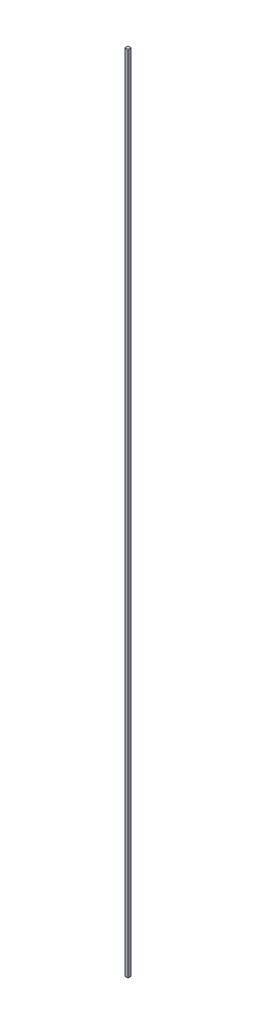
ISO-10303-21;
HEADER;
FILE_DESCRIPTION(('STEP AP214'),'2;1');
FILE_NAME('part.step','',(''),(''),'','','');
FILE_SCHEMA(('AUTOMOTIVE_DESIGN { 1 0 10303 214 1 1 1 1 }'));
ENDSEC;
DATA;
#1=APPLICATION_CONTEXT('core data for automotive mechanical design processes');
#2=APPLICATION_PROTOCOL_DEFINITION('international standard','automotive_design',2000,#1);
#3=PRODUCT_CONTEXT('',#1,'mechanical');
#4=PRODUCT('Part','Part','',(#3));
#5=PRODUCT_RELATED_PRODUCT_CATEGORY('part','',(#4));
#6=PRODUCT_DEFINITION_FORMATION('','',#4);
#7=PRODUCT_DEFINITION_CONTEXT('part definition',#1,'design');
#8=PRODUCT_DEFINITION('design','',#6,#7);
#9=PRODUCT_DEFINITION_SHAPE('','',#8);
#10=(LENGTH_UNIT() NAMED_UNIT(*) SI_UNIT(.MILLI.,.METRE.));
#11=(NAMED_UNIT(*) PLANE_ANGLE_UNIT() SI_UNIT($,.RADIAN.));
#12=(NAMED_UNIT(*) SI_UNIT($,.STERADIAN.) SOLID_ANGLE_UNIT());
#13=UNCERTAINTY_MEASURE_WITH_UNIT(LENGTH_MEASURE(1.E-05),#10,'distance_accuracy_value','');
#14=(GEOMETRIC_REPRESENTATION_CONTEXT(3) GLOBAL_UNCERTAINTY_ASSIGNED_CONTEXT((#13)) GLOBAL_UNIT_ASSIGNED_CONTEXT((#10,
#11,#12)) REPRESENTATION_CONTEXT('',''));
#15=CARTESIAN_POINT('',(0.,0.,0.));
#16=DIRECTION('',(0.,0.,1.));
#17=DIRECTION('',(1.,0.,0.));
#18=AXIS2_PLACEMENT_3D('',#15,#16,#17);
#19=CARTESIAN_POINT('',(0.,509.4,0.));
#20=DIRECTION('',(1.,0.,0.));
#21=DIRECTION('',(0.,0.,-1.));
#22=AXIS2_PLACEMENT_3D('',#19,#20,#21);
#23=PLANE('',#22);
#24=DIRECTION('',(0.,0.,1.));
#25=VECTOR('',#24,1.);
#26=CARTESIAN_POINT('',(0.,0.,0.));
#27=LINE('',#26,#25);
#28=CARTESIAN_POINT('',(0.,0.,-2.));
#29=VERTEX_POINT('',#28);
#30=CARTESIAN_POINT('',(0.,0.,0.));
#31=VERTEX_POINT('',#30);
#32=EDGE_CURVE('E102',#29,#31,#27,.T.);
#33=ORIENTED_EDGE('',*,*,#32,.T.);
#34=DIRECTION('',(0.,-1.,0.));
#35=VECTOR('',#34,1.);
#36=CARTESIAN_POINT('',(0.,509.4,0.));
#37=LINE('',#36,#35);
#38=CARTESIAN_POINT('',(0.,509.4,0.));
#39=VERTEX_POINT('',#38);
#40=EDGE_CURVE('E11',#39,#31,#37,.T.);
#41=ORIENTED_EDGE('',*,*,#40,.F.);
#42=DIRECTION('',(0.,0.,1.));
#43=VECTOR('',#42,1.);
#44=CARTESIAN_POINT('',(0.,509.4,0.));
#45=LINE('',#44,#43);
#46=CARTESIAN_POINT('',(0.,509.4,-2.));
#47=VERTEX_POINT('',#46);
#48=EDGE_CURVE('E90',#47,#39,#45,.T.);
#49=ORIENTED_EDGE('',*,*,#48,.F.);
#50=DIRECTION('',(0.,-1.,0.));
#51=VECTOR('',#50,1.);
#52=CARTESIAN_POINT('',(0.,509.4,-2.));
#53=LINE('',#52,#51);
#54=EDGE_CURVE('E98',#47,#29,#53,.T.);
#55=ORIENTED_EDGE('',*,*,#54,.T.);
#56=EDGE_LOOP('',(#33,#41,#49,#55));
#57=FACE_BOUND('',#56,.T.);
#58=ADVANCED_FACE('F39',(#57),#23,.F.);
#59=CARTESIAN_POINT('',(0.,509.4,0.));
#60=DIRECTION('',(0.,0.,-1.));
#61=DIRECTION('',(-1.,0.,0.));
#62=AXIS2_PLACEMENT_3D('',#59,#60,#61);
#63=PLANE('',#62);
#64=DIRECTION('',(1.,0.,0.));
#65=VECTOR('',#64,1.);
#66=CARTESIAN_POINT('',(0.,0.,0.));
#67=LINE('',#66,#65);
#68=CARTESIAN_POINT('',(2.,0.,0.));
#69=VERTEX_POINT('',#68);
#70=EDGE_CURVE('E94',#31,#69,#67,.T.);
#71=ORIENTED_EDGE('',*,*,#70,.T.);
#72=DIRECTION('',(0.,-1.,0.));
#73=VECTOR('',#72,1.);
#74=CARTESIAN_POINT('',(2.,509.4,0.));
#75=LINE('',#74,#73);
#76=CARTESIAN_POINT('',(2.,509.4,0.));
#77=VERTEX_POINT('',#76);
#78=EDGE_CURVE('E47',#77,#69,#75,.T.);
#79=ORIENTED_EDGE('',*,*,#78,.F.);
#80=DIRECTION('',(1.,0.,0.));
#81=VECTOR('',#80,1.);
#82=CARTESIAN_POINT('',(0.,509.4,0.));
#83=LINE('',#82,#81);
#84=EDGE_CURVE('E85',#39,#77,#83,.T.);
#85=ORIENTED_EDGE('',*,*,#84,.F.);
#86=ORIENTED_EDGE('',*,*,#40,.T.);
#87=EDGE_LOOP('',(#71,#79,#85,#86));
#88=FACE_BOUND('',#87,.T.);
#89=ADVANCED_FACE('F93',(#88),#63,.F.);
#90=CARTESIAN_POINT('',(2.,509.4,0.));
#91=DIRECTION('',(-1.,0.,0.));
#92=DIRECTION('',(0.,0.,1.));
#93=AXIS2_PLACEMENT_3D('',#90,#91,#92);
#94=PLANE('',#93);
#95=DIRECTION('',(0.,0.,-1.));
#96=VECTOR('',#95,1.);
#97=CARTESIAN_POINT('',(2.,0.,0.));
#98=LINE('',#97,#96);
#99=CARTESIAN_POINT('',(2.,0.,-2.));
#100=VERTEX_POINT('',#99);
#101=EDGE_CURVE('E72',#69,#100,#98,.T.);
#102=ORIENTED_EDGE('',*,*,#101,.T.);
#103=DIRECTION('',(0.,-1.,0.));
#104=VECTOR('',#103,1.);
#105=CARTESIAN_POINT('',(2.,509.4,-2.));
#106=LINE('',#105,#104);
#107=CARTESIAN_POINT('',(2.,509.4,-2.));
#108=VERTEX_POINT('',#107);
#109=EDGE_CURVE('E95',#108,#100,#106,.T.);
#110=ORIENTED_EDGE('',*,*,#109,.F.);
#111=DIRECTION('',(0.,0.,-1.));
#112=VECTOR('',#111,1.);
#113=CARTESIAN_POINT('',(2.,509.4,0.));
#114=LINE('',#113,#112);
#115=EDGE_CURVE('E88',#77,#108,#114,.T.);
#116=ORIENTED_EDGE('',*,*,#115,.F.);
#117=ORIENTED_EDGE('',*,*,#78,.T.);
#118=EDGE_LOOP('',(#102,#110,#116,#117));
#119=FACE_BOUND('',#118,.T.);
#120=ADVANCED_FACE('F96',(#119),#94,.F.);
#121=CARTESIAN_POINT('',(0.,509.4,-2.));
#122=DIRECTION('',(0.,0.,1.));
#123=DIRECTION('',(1.,0.,0.));
#124=AXIS2_PLACEMENT_3D('',#121,#122,#123);
#125=PLANE('',#124);
#126=DIRECTION('',(-1.,0.,0.));
#127=VECTOR('',#126,1.);
#128=CARTESIAN_POINT('',(0.,0.,-2.));
#129=LINE('',#128,#127);
#130=EDGE_CURVE('E78',#100,#29,#129,.T.);
#131=ORIENTED_EDGE('',*,*,#130,.T.);
#132=ORIENTED_EDGE('',*,*,#54,.F.);
#133=DIRECTION('',(-1.,0.,0.));
#134=VECTOR('',#133,1.);
#135=CARTESIAN_POINT('',(0.,509.4,-2.));
#136=LINE('',#135,#134);
#137=EDGE_CURVE('E55',#108,#47,#136,.T.);
#138=ORIENTED_EDGE('',*,*,#137,.F.);
#139=ORIENTED_EDGE('',*,*,#109,.T.);
#140=EDGE_LOOP('',(#131,#132,#138,#139));
#141=FACE_BOUND('',#140,.T.);
#142=ADVANCED_FACE('F109',(#141),#125,.F.);
#143=CARTESIAN_POINT('',(0.,509.4,0.));
#144=DIRECTION('',(0.,-1.,0.));
#145=DIRECTION('',(0.,0.,-1.));
#146=AXIS2_PLACEMENT_3D('',#143,#144,#145);
#147=PLANE('',#146);
#148=ORIENTED_EDGE('',*,*,#48,.T.);
#149=ORIENTED_EDGE('',*,*,#84,.T.);
#150=ORIENTED_EDGE('',*,*,#115,.T.);
#151=ORIENTED_EDGE('',*,*,#137,.T.);
#152=EDGE_LOOP('',(#148,#149,#150,#151));
#153=FACE_BOUND('',#152,.T.);
#154=ADVANCED_FACE('F86',(#153),#147,.F.);
#155=CARTESIAN_POINT('',(0.,0.,0.));
#156=DIRECTION('',(0.,-1.,0.));
#157=DIRECTION('',(0.,0.,-1.));
#158=AXIS2_PLACEMENT_3D('',#155,#156,#157);
#159=PLANE('',#158);
#160=ORIENTED_EDGE('',*,*,#32,.F.);
#161=ORIENTED_EDGE('',*,*,#130,.F.);
#162=ORIENTED_EDGE('',*,*,#101,.F.);
#163=ORIENTED_EDGE('',*,*,#70,.F.);
#164=EDGE_LOOP('',(#160,#161,#162,#163));
#165=FACE_BOUND('',#164,.T.);
#166=ADVANCED_FACE('F112',(#165),#159,.T.);
#167=CLOSED_SHELL('',(#58,#89,#120,#142,#154,#166));
#168=MANIFOLD_SOLID_BREP('B2',#167);
#169=ADVANCED_BREP_SHAPE_REPRESENTATION('',(#18,#168),#14);
#170=SHAPE_DEFINITION_REPRESENTATION(#9,#169);
ENDSEC;
END-ISO-10303-21;
